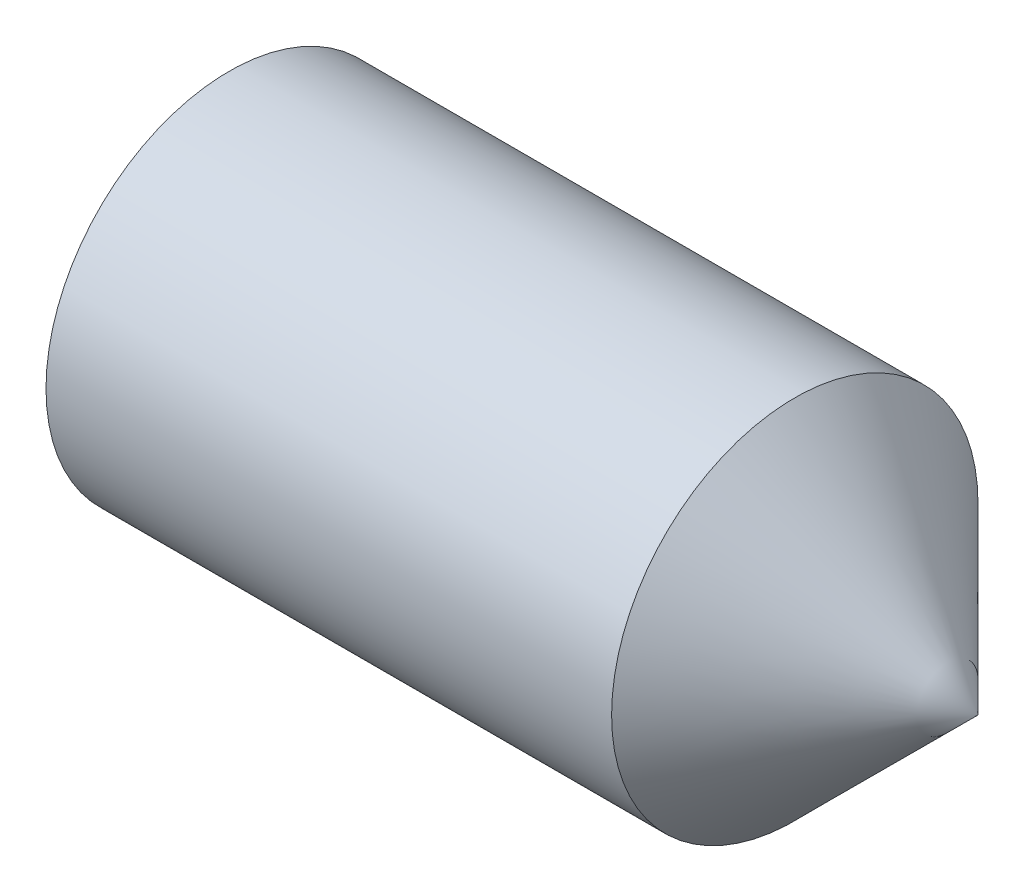
ISO-10303-21;
HEADER;
FILE_DESCRIPTION(('STEP AP214'),'2;1');
FILE_NAME('part.step','',(''),(''),'','','');
FILE_SCHEMA(('AUTOMOTIVE_DESIGN { 1 0 10303 214 1 1 1 1 }'));
ENDSEC;
DATA;
#1=APPLICATION_CONTEXT('core data for automotive mechanical design processes');
#2=APPLICATION_PROTOCOL_DEFINITION('international standard','automotive_design',2000,#1);
#3=PRODUCT_CONTEXT('',#1,'mechanical');
#4=PRODUCT('Part','Part','',(#3));
#5=PRODUCT_RELATED_PRODUCT_CATEGORY('part','',(#4));
#6=PRODUCT_DEFINITION_FORMATION('','',#4);
#7=PRODUCT_DEFINITION_CONTEXT('part definition',#1,'design');
#8=PRODUCT_DEFINITION('design','',#6,#7);
#9=PRODUCT_DEFINITION_SHAPE('','',#8);
#10=(LENGTH_UNIT() NAMED_UNIT(*) SI_UNIT(.MILLI.,.METRE.));
#11=(NAMED_UNIT(*) PLANE_ANGLE_UNIT() SI_UNIT($,.RADIAN.));
#12=(NAMED_UNIT(*) SI_UNIT($,.STERADIAN.) SOLID_ANGLE_UNIT());
#13=UNCERTAINTY_MEASURE_WITH_UNIT(LENGTH_MEASURE(1.E-05),#10,'distance_accuracy_value','');
#14=(GEOMETRIC_REPRESENTATION_CONTEXT(3) GLOBAL_UNCERTAINTY_ASSIGNED_CONTEXT((#13)) GLOBAL_UNIT_ASSIGNED_CONTEXT((#10,
#11,#12)) REPRESENTATION_CONTEXT('',''));
#15=CARTESIAN_POINT('',(0.,0.,0.));
#16=DIRECTION('',(0.,0.,1.));
#17=DIRECTION('',(1.,0.,0.));
#18=AXIS2_PLACEMENT_3D('',#15,#16,#17);
#19=CARTESIAN_POINT('',(0.,0.,0.));
#20=DIRECTION('',(-1.,0.,0.));
#21=DIRECTION('',(0.,0.,1.));
#22=AXIS2_PLACEMENT_3D('',#19,#20,#21);
#23=PLANE('',#22);
#24=CARTESIAN_POINT('',(0.,0.,0.));
#25=DIRECTION('',(-1.,0.,0.));
#26=DIRECTION('',(0.,0.,1.));
#27=AXIS2_PLACEMENT_3D('',#24,#25,#26);
#28=CIRCLE('',#27,10.352);
#29=CARTESIAN_POINT('',(0.,0.,10.352));
#30=VERTEX_POINT('',#29);
#31=EDGE_CURVE('E11',#30,#30,#28,.T.);
#32=ORIENTED_EDGE('',*,*,#31,.T.);
#33=EDGE_LOOP('',(#32));
#34=FACE_BOUND('',#33,.T.);
#35=DIRECTION('',(0.,0.,-1.));
#36=VECTOR('',#35,1.);
#37=CARTESIAN_POINT('',(0.,6.,3.46410161513775));
#38=LINE('',#37,#36);
#39=CARTESIAN_POINT('',(0.,6.,3.46410161513775));
#40=VERTEX_POINT('',#39);
#41=CARTESIAN_POINT('',(0.,6.,-3.46410161513776));
#42=VERTEX_POINT('',#41);
#43=EDGE_CURVE('E95',#40,#42,#38,.T.);
#44=ORIENTED_EDGE('',*,*,#43,.F.);
#45=DIRECTION('',(0.,-0.866025403784439,0.5));
#46=VECTOR('',#45,1.);
#47=CARTESIAN_POINT('',(0.,6.,3.46410161513775));
#48=LINE('',#47,#46);
#49=CARTESIAN_POINT('',(0.,0.,6.9282032302755));
#50=VERTEX_POINT('',#49);
#51=EDGE_CURVE('E48',#40,#50,#48,.T.);
#52=ORIENTED_EDGE('',*,*,#51,.T.);
#53=DIRECTION('',(0.,0.866025403784439,0.5));
#54=VECTOR('',#53,1.);
#55=CARTESIAN_POINT('',(0.,-5.99999999999999,3.46410161513775));
#56=LINE('',#55,#54);
#57=CARTESIAN_POINT('',(0.,-5.99999999999999,3.46410161513775));
#58=VERTEX_POINT('',#57);
#59=EDGE_CURVE('E101',#58,#50,#56,.T.);
#60=ORIENTED_EDGE('',*,*,#59,.F.);
#61=DIRECTION('',(0.,0.,-1.));
#62=VECTOR('',#61,1.);
#63=CARTESIAN_POINT('',(0.,-5.99999999999999,3.46410161513775));
#64=LINE('',#63,#62);
#65=CARTESIAN_POINT('',(0.,-5.99999999999999,-3.46410161513776));
#66=VERTEX_POINT('',#65);
#67=EDGE_CURVE('E121',#58,#66,#64,.T.);
#68=ORIENTED_EDGE('',*,*,#67,.T.);
#69=DIRECTION('',(0.,0.866025403784438,-0.5));
#70=VECTOR('',#69,1.);
#71=CARTESIAN_POINT('',(0.,-5.99999999999999,-3.46410161513776));
#72=LINE('',#71,#70);
#73=CARTESIAN_POINT('',(0.,0.,-6.92820323027551));
#74=VERTEX_POINT('',#73);
#75=EDGE_CURVE('E124',#66,#74,#72,.T.);
#76=ORIENTED_EDGE('',*,*,#75,.T.);
#77=DIRECTION('',(0.,-0.866025403784439,-0.5));
#78=VECTOR('',#77,1.);
#79=CARTESIAN_POINT('',(0.,6.,-3.46410161513776));
#80=LINE('',#79,#78);
#81=EDGE_CURVE('E127',#42,#74,#80,.T.);
#82=ORIENTED_EDGE('',*,*,#81,.F.);
#83=EDGE_LOOP('',(#44,#52,#60,#68,#76,#82));
#84=FACE_BOUND('',#83,.T.);
#85=ADVANCED_FACE('F34',(#34,#84),#23,.T.);
#86=CARTESIAN_POINT('',(0.,0.,0.));
#87=DIRECTION('',(1.,0.,0.));
#88=DIRECTION('',(0.,0.,-1.));
#89=AXIS2_PLACEMENT_3D('',#86,#87,#88);
#90=CONICAL_SURFACE('',#89,10.352,1.0471975511966);
#91=CARTESIAN_POINT('',(0.951473243624499,0.,0.));
#92=DIRECTION('',(-1.,0.,0.));
#93=DIRECTION('',(0.,0.,1.));
#94=AXIS2_PLACEMENT_3D('',#91,#92,#93);
#95=CIRCLE('',#94,12.);
#96=CARTESIAN_POINT('',(0.951473243624499,0.,12.));
#97=VERTEX_POINT('',#96);
#98=EDGE_CURVE('E41',#97,#97,#95,.T.);
#99=ORIENTED_EDGE('',*,*,#98,.T.);
#100=EDGE_LOOP('',(#99));
#101=FACE_BOUND('',#100,.T.);
#102=ORIENTED_EDGE('',*,*,#31,.F.);
#103=EDGE_LOOP('',(#102));
#104=FACE_BOUND('',#103,.T.);
#105=ADVANCED_FACE('F144',(#101,#104),#90,.T.);
#106=CARTESIAN_POINT('',(-12.7,0.,0.));
#107=DIRECTION('',(-1.,0.,0.));
#108=DIRECTION('',(0.,0.,1.));
#109=AXIS2_PLACEMENT_3D('',#106,#107,#108);
#110=CYLINDRICAL_SURFACE('',#109,12.);
#111=CARTESIAN_POINT('',(38.,0.,0.));
#112=DIRECTION('',(-1.,0.,0.));
#113=DIRECTION('',(0.,0.,1.));
#114=AXIS2_PLACEMENT_3D('',#111,#112,#113);
#115=CIRCLE('',#114,12.);
#116=CARTESIAN_POINT('',(38.,0.,12.));
#117=VERTEX_POINT('',#116);
#118=EDGE_CURVE('E102',#117,#117,#115,.T.);
#119=ORIENTED_EDGE('',*,*,#118,.T.);
#120=EDGE_LOOP('',(#119));
#121=FACE_BOUND('',#120,.T.);
#122=ORIENTED_EDGE('',*,*,#98,.F.);
#123=EDGE_LOOP('',(#122));
#124=FACE_BOUND('',#123,.T.);
#125=ADVANCED_FACE('F147',(#121,#124),#110,.T.);
#126=CARTESIAN_POINT('',(38.,0.,0.));
#127=DIRECTION('',(-1.,0.,0.));
#128=DIRECTION('',(0.,0.,1.));
#129=AXIS2_PLACEMENT_3D('',#126,#127,#128);
#130=CONICAL_SURFACE('',#129,12.,0.78539816339745);
#131=CARTESIAN_POINT('',(50.,0.,0.));
#132=VERTEX_POINT('',#131);
#133=VERTEX_LOOP('',#132);
#134=FACE_BOUND('',#133,.T.);
#135=ORIENTED_EDGE('',*,*,#118,.F.);
#136=EDGE_LOOP('',(#135));
#137=FACE_BOUND('',#136,.T.);
#138=ADVANCED_FACE('F149',(#134,#137),#130,.T.);
#139=CARTESIAN_POINT('',(15.,6.,3.46410161513775));
#140=DIRECTION('',(0.,-0.5,-0.866025403784439));
#141=DIRECTION('',(0.,0.866025403784439,-0.5));
#142=AXIS2_PLACEMENT_3D('',#139,#140,#141);
#143=PLANE('',#142);
#144=ORIENTED_EDGE('',*,*,#51,.F.);
#145=DIRECTION('',(-1.,0.,0.));
#146=VECTOR('',#145,1.);
#147=CARTESIAN_POINT('',(15.,6.,3.46410161513775));
#148=LINE('',#147,#146);
#149=CARTESIAN_POINT('',(15.,6.,3.46410161513775));
#150=VERTEX_POINT('',#149);
#151=EDGE_CURVE('E89',#150,#40,#148,.T.);
#152=ORIENTED_EDGE('',*,*,#151,.F.);
#153=DIRECTION('',(0.,-0.866025403784439,0.5));
#154=VECTOR('',#153,1.);
#155=CARTESIAN_POINT('',(15.,6.,3.46410161513775));
#156=LINE('',#155,#154);
#157=CARTESIAN_POINT('',(15.,0.,6.9282032302755));
#158=VERTEX_POINT('',#157);
#159=EDGE_CURVE('E84',#150,#158,#156,.T.);
#160=ORIENTED_EDGE('',*,*,#159,.T.);
#161=DIRECTION('',(-1.,0.,0.));
#162=VECTOR('',#161,1.);
#163=CARTESIAN_POINT('',(15.,0.,6.9282032302755));
#164=LINE('',#163,#162);
#165=EDGE_CURVE('E87',#158,#50,#164,.T.);
#166=ORIENTED_EDGE('',*,*,#165,.T.);
#167=EDGE_LOOP('',(#144,#152,#160,#166));
#168=FACE_BOUND('',#167,.T.);
#169=ADVANCED_FACE('F86',(#168),#143,.T.);
#170=CARTESIAN_POINT('',(15.,-5.99999999999999,3.46410161513775));
#171=DIRECTION('',(0.,-0.5,0.866025403784439));
#172=DIRECTION('',(0.,-0.866025403784439,-0.5));
#173=AXIS2_PLACEMENT_3D('',#170,#171,#172);
#174=PLANE('',#173);
#175=ORIENTED_EDGE('',*,*,#59,.T.);
#176=ORIENTED_EDGE('',*,*,#165,.F.);
#177=DIRECTION('',(0.,0.866025403784439,0.5));
#178=VECTOR('',#177,1.);
#179=CARTESIAN_POINT('',(15.,-5.99999999999999,3.46410161513775));
#180=LINE('',#179,#178);
#181=CARTESIAN_POINT('',(15.,-5.99999999999999,3.46410161513775));
#182=VERTEX_POINT('',#181);
#183=EDGE_CURVE('E94',#182,#158,#180,.T.);
#184=ORIENTED_EDGE('',*,*,#183,.F.);
#185=DIRECTION('',(-1.,0.,0.));
#186=VECTOR('',#185,1.);
#187=CARTESIAN_POINT('',(15.,-5.99999999999999,3.46410161513775));
#188=LINE('',#187,#186);
#189=EDGE_CURVE('E103',#182,#58,#188,.T.);
#190=ORIENTED_EDGE('',*,*,#189,.T.);
#191=EDGE_LOOP('',(#175,#176,#184,#190));
#192=FACE_BOUND('',#191,.T.);
#193=ADVANCED_FACE('F99',(#192),#174,.F.);
#194=CARTESIAN_POINT('',(15.,-5.99999999999999,3.46410161513775));
#195=DIRECTION('',(0.,1.,0.));
#196=DIRECTION('',(0.,0.,1.));
#197=AXIS2_PLACEMENT_3D('',#194,#195,#196);
#198=PLANE('',#197);
#199=ORIENTED_EDGE('',*,*,#67,.F.);
#200=ORIENTED_EDGE('',*,*,#189,.F.);
#201=DIRECTION('',(0.,0.,-1.));
#202=VECTOR('',#201,1.);
#203=CARTESIAN_POINT('',(15.,-5.99999999999999,3.46410161513775));
#204=LINE('',#203,#202);
#205=CARTESIAN_POINT('',(15.,-5.99999999999999,-3.46410161513776));
#206=VERTEX_POINT('',#205);
#207=EDGE_CURVE('E108',#182,#206,#204,.T.);
#208=ORIENTED_EDGE('',*,*,#207,.T.);
#209=DIRECTION('',(-1.,0.,0.));
#210=VECTOR('',#209,1.);
#211=CARTESIAN_POINT('',(15.,-5.99999999999999,-3.46410161513776));
#212=LINE('',#211,#210);
#213=EDGE_CURVE('E137',#206,#66,#212,.T.);
#214=ORIENTED_EDGE('',*,*,#213,.T.);
#215=EDGE_LOOP('',(#199,#200,#208,#214));
#216=FACE_BOUND('',#215,.T.);
#217=ADVANCED_FACE('F177',(#216),#198,.T.);
#218=CARTESIAN_POINT('',(15.,-5.99999999999999,-3.46410161513776));
#219=DIRECTION('',(0.,0.5,0.866025403784438));
#220=DIRECTION('',(0.,-0.866025403784439,0.5));
#221=AXIS2_PLACEMENT_3D('',#218,#219,#220);
#222=PLANE('',#221);
#223=ORIENTED_EDGE('',*,*,#75,.F.);
#224=ORIENTED_EDGE('',*,*,#213,.F.);
#225=DIRECTION('',(0.,0.866025403784438,-0.5));
#226=VECTOR('',#225,1.);
#227=CARTESIAN_POINT('',(15.,-5.99999999999999,-3.46410161513776));
#228=LINE('',#227,#226);
#229=CARTESIAN_POINT('',(15.,0.,-6.92820323027551));
#230=VERTEX_POINT('',#229);
#231=EDGE_CURVE('E110',#206,#230,#228,.T.);
#232=ORIENTED_EDGE('',*,*,#231,.T.);
#233=DIRECTION('',(-1.,0.,0.));
#234=VECTOR('',#233,1.);
#235=CARTESIAN_POINT('',(15.,0.,-6.92820323027551));
#236=LINE('',#235,#234);
#237=EDGE_CURVE('E135',#230,#74,#236,.T.);
#238=ORIENTED_EDGE('',*,*,#237,.T.);
#239=EDGE_LOOP('',(#223,#224,#232,#238));
#240=FACE_BOUND('',#239,.T.);
#241=ADVANCED_FACE('F173',(#240),#222,.T.);
#242=CARTESIAN_POINT('',(15.,6.,-3.46410161513776));
#243=DIRECTION('',(0.,0.5,-0.866025403784438));
#244=DIRECTION('',(0.,0.866025403784439,0.5));
#245=AXIS2_PLACEMENT_3D('',#242,#243,#244);
#246=PLANE('',#245);
#247=ORIENTED_EDGE('',*,*,#81,.T.);
#248=ORIENTED_EDGE('',*,*,#237,.F.);
#249=DIRECTION('',(0.,-0.866025403784439,-0.5));
#250=VECTOR('',#249,1.);
#251=CARTESIAN_POINT('',(15.,6.,-3.46410161513776));
#252=LINE('',#251,#250);
#253=CARTESIAN_POINT('',(15.,6.,-3.46410161513776));
#254=VERTEX_POINT('',#253);
#255=EDGE_CURVE('E114',#254,#230,#252,.T.);
#256=ORIENTED_EDGE('',*,*,#255,.F.);
#257=DIRECTION('',(-1.,0.,0.));
#258=VECTOR('',#257,1.);
#259=CARTESIAN_POINT('',(15.,6.,-3.46410161513776));
#260=LINE('',#259,#258);
#261=EDGE_CURVE('E133',#254,#42,#260,.T.);
#262=ORIENTED_EDGE('',*,*,#261,.T.);
#263=EDGE_LOOP('',(#247,#248,#256,#262));
#264=FACE_BOUND('',#263,.T.);
#265=ADVANCED_FACE('F170',(#264),#246,.F.);
#266=CARTESIAN_POINT('',(15.,6.,3.46410161513775));
#267=DIRECTION('',(0.,1.,0.));
#268=DIRECTION('',(0.,0.,1.));
#269=AXIS2_PLACEMENT_3D('',#266,#267,#268);
#270=PLANE('',#269);
#271=ORIENTED_EDGE('',*,*,#43,.T.);
#272=ORIENTED_EDGE('',*,*,#261,.F.);
#273=DIRECTION('',(0.,0.,-1.));
#274=VECTOR('',#273,1.);
#275=CARTESIAN_POINT('',(15.,6.,3.46410161513775));
#276=LINE('',#275,#274);
#277=EDGE_CURVE('E117',#150,#254,#276,.T.);
#278=ORIENTED_EDGE('',*,*,#277,.F.);
#279=ORIENTED_EDGE('',*,*,#151,.T.);
#280=EDGE_LOOP('',(#271,#272,#278,#279));
#281=FACE_BOUND('',#280,.T.);
#282=ADVANCED_FACE('F166',(#281),#270,.F.);
#283=CARTESIAN_POINT('',(15.,6.,3.46410161513775));
#284=DIRECTION('',(1.,0.,0.));
#285=DIRECTION('',(0.,0.,-1.));
#286=AXIS2_PLACEMENT_3D('',#283,#284,#285);
#287=PLANE('',#286);
#288=ORIENTED_EDGE('',*,*,#159,.F.);
#289=ORIENTED_EDGE('',*,*,#277,.T.);
#290=ORIENTED_EDGE('',*,*,#255,.T.);
#291=ORIENTED_EDGE('',*,*,#231,.F.);
#292=ORIENTED_EDGE('',*,*,#207,.F.);
#293=ORIENTED_EDGE('',*,*,#183,.T.);
#294=EDGE_LOOP('',(#288,#289,#290,#291,#292,#293));
#295=FACE_BOUND('',#294,.T.);
#296=ADVANCED_FACE('F106',(#295),#287,.F.);
#297=CLOSED_SHELL('',(#85,#105,#125,#138,#169,#193,#217,#241,#265,#282,#296));
#298=MANIFOLD_SOLID_BREP('B2',#297);
#299=ADVANCED_BREP_SHAPE_REPRESENTATION('',(#18,#298),#14);
#300=SHAPE_DEFINITION_REPRESENTATION(#9,#299);
ENDSEC;
END-ISO-10303-21;
